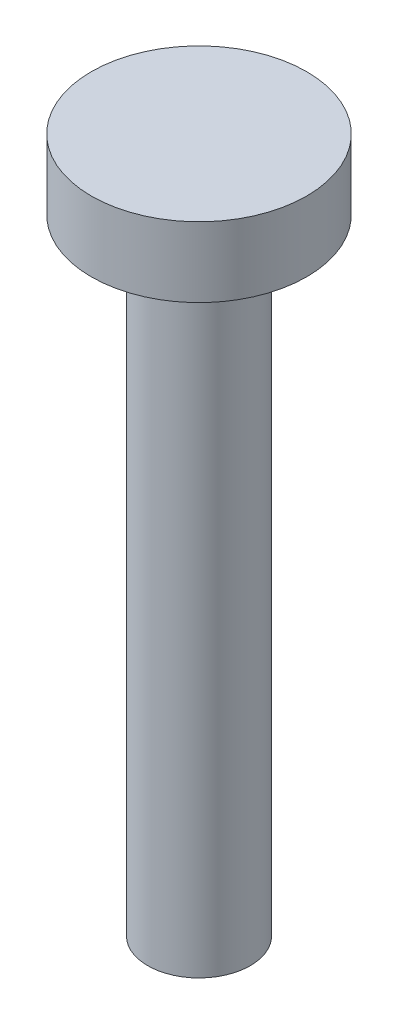
ISO-10303-21;
HEADER;
FILE_DESCRIPTION(('STEP AP214'),'2;1');
FILE_NAME('part.step','',(''),(''),'','','');
FILE_SCHEMA(('AUTOMOTIVE_DESIGN { 1 0 10303 214 1 1 1 1 }'));
ENDSEC;
DATA;
#1=APPLICATION_CONTEXT('core data for automotive mechanical design processes');
#2=APPLICATION_PROTOCOL_DEFINITION('international standard','automotive_design',2000,#1);
#3=PRODUCT_CONTEXT('',#1,'mechanical');
#4=PRODUCT('Part','Part','',(#3));
#5=PRODUCT_RELATED_PRODUCT_CATEGORY('part','',(#4));
#6=PRODUCT_DEFINITION_FORMATION('','',#4);
#7=PRODUCT_DEFINITION_CONTEXT('part definition',#1,'design');
#8=PRODUCT_DEFINITION('design','',#6,#7);
#9=PRODUCT_DEFINITION_SHAPE('','',#8);
#10=(LENGTH_UNIT() NAMED_UNIT(*) SI_UNIT(.MILLI.,.METRE.));
#11=(NAMED_UNIT(*) PLANE_ANGLE_UNIT() SI_UNIT($,.RADIAN.));
#12=(NAMED_UNIT(*) SI_UNIT($,.STERADIAN.) SOLID_ANGLE_UNIT());
#13=UNCERTAINTY_MEASURE_WITH_UNIT(LENGTH_MEASURE(1.E-05),#10,'distance_accuracy_value','');
#14=(GEOMETRIC_REPRESENTATION_CONTEXT(3) GLOBAL_UNCERTAINTY_ASSIGNED_CONTEXT((#13)) GLOBAL_UNIT_ASSIGNED_CONTEXT((#10,
#11,#12)) REPRESENTATION_CONTEXT('',''));
#15=CARTESIAN_POINT('',(0.,0.,0.));
#16=DIRECTION('',(0.,0.,1.));
#17=DIRECTION('',(1.,0.,0.));
#18=AXIS2_PLACEMENT_3D('',#15,#16,#17);
#19=CARTESIAN_POINT('',(0.,0.,0.));
#20=DIRECTION('',(0.,-1.,0.));
#21=DIRECTION('',(0.,0.,-1.));
#22=AXIS2_PLACEMENT_3D('',#19,#20,#21);
#23=PLANE('',#22);
#24=CARTESIAN_POINT('',(0.,0.,0.));
#25=DIRECTION('',(0.,-1.,0.));
#26=DIRECTION('',(0.,0.,-1.));
#27=AXIS2_PLACEMENT_3D('',#24,#25,#26);
#28=CIRCLE('',#27,4.7625);
#29=CARTESIAN_POINT('',(0.,0.,-4.7625));
#30=VERTEX_POINT('',#29);
#31=EDGE_CURVE('E10',#30,#30,#28,.T.);
#32=ORIENTED_EDGE('',*,*,#31,.T.);
#33=EDGE_LOOP('',(#32));
#34=FACE_BOUND('',#33,.T.);
#35=ADVANCED_FACE('F39',(#34),#23,.T.);
#36=CARTESIAN_POINT('',(0.,0.,0.));
#37=DIRECTION('',(0.,-1.,0.));
#38=DIRECTION('',(0.,0.,-1.));
#39=AXIS2_PLACEMENT_3D('',#36,#37,#38);
#40=CYLINDRICAL_SURFACE('',#39,4.7625);
#41=CARTESIAN_POINT('',(0.,58.,0.));
#42=DIRECTION('',(0.,-1.,0.));
#43=DIRECTION('',(0.,0.,-1.));
#44=AXIS2_PLACEMENT_3D('',#41,#42,#43);
#45=CIRCLE('',#44,4.7625);
#46=CARTESIAN_POINT('',(0.,58.,-4.7625));
#47=VERTEX_POINT('',#46);
#48=EDGE_CURVE('E44',#47,#47,#45,.T.);
#49=ORIENTED_EDGE('',*,*,#48,.T.);
#50=EDGE_LOOP('',(#49));
#51=FACE_BOUND('',#50,.T.);
#52=ORIENTED_EDGE('',*,*,#31,.F.);
#53=EDGE_LOOP('',(#52));
#54=FACE_BOUND('',#53,.T.);
#55=ADVANCED_FACE('F72',(#51,#54),#40,.T.);
#56=CARTESIAN_POINT('',(4.7625,58.,0.));
#57=DIRECTION('',(0.,-1.,0.));
#58=DIRECTION('',(0.,0.,-1.));
#59=AXIS2_PLACEMENT_3D('',#56,#57,#58);
#60=PLANE('',#59);
#61=CARTESIAN_POINT('',(0.,58.,0.));
#62=DIRECTION('',(0.,-1.,0.));
#63=DIRECTION('',(0.,0.,-1.));
#64=AXIS2_PLACEMENT_3D('',#61,#62,#63);
#65=CIRCLE('',#64,10.);
#66=CARTESIAN_POINT('',(0.,58.,-10.));
#67=VERTEX_POINT('',#66);
#68=EDGE_CURVE('E47',#67,#67,#65,.T.);
#69=ORIENTED_EDGE('',*,*,#68,.T.);
#70=EDGE_LOOP('',(#69));
#71=FACE_BOUND('',#70,.T.);
#72=ORIENTED_EDGE('',*,*,#48,.F.);
#73=EDGE_LOOP('',(#72));
#74=FACE_BOUND('',#73,.T.);
#75=ADVANCED_FACE('F66',(#71,#74),#60,.T.);
#76=CARTESIAN_POINT('',(0.,0.,0.));
#77=DIRECTION('',(0.,-1.,0.));
#78=DIRECTION('',(0.,0.,-1.));
#79=AXIS2_PLACEMENT_3D('',#76,#77,#78);
#80=CYLINDRICAL_SURFACE('',#79,10.);
#81=CARTESIAN_POINT('',(0.,64.5,0.));
#82=DIRECTION('',(0.,-1.,0.));
#83=DIRECTION('',(0.,0.,-1.));
#84=AXIS2_PLACEMENT_3D('',#81,#82,#83);
#85=CIRCLE('',#84,10.);
#86=CARTESIAN_POINT('',(0.,64.5,-10.));
#87=VERTEX_POINT('',#86);
#88=EDGE_CURVE('E52',#87,#87,#85,.T.);
#89=ORIENTED_EDGE('',*,*,#88,.T.);
#90=EDGE_LOOP('',(#89));
#91=FACE_BOUND('',#90,.T.);
#92=ORIENTED_EDGE('',*,*,#68,.F.);
#93=EDGE_LOOP('',(#92));
#94=FACE_BOUND('',#93,.T.);
#95=ADVANCED_FACE('F56',(#91,#94),#80,.T.);
#96=CARTESIAN_POINT('',(10.,64.5,0.));
#97=DIRECTION('',(0.,1.,0.));
#98=DIRECTION('',(0.,0.,1.));
#99=AXIS2_PLACEMENT_3D('',#96,#97,#98);
#100=PLANE('',#99);
#101=ORIENTED_EDGE('',*,*,#88,.F.);
#102=EDGE_LOOP('',(#101));
#103=FACE_BOUND('',#102,.T.);
#104=ADVANCED_FACE('F65',(#103),#100,.T.);
#105=CLOSED_SHELL('',(#35,#55,#75,#95,#104));
#106=MANIFOLD_SOLID_BREP('B2',#105);
#107=ADVANCED_BREP_SHAPE_REPRESENTATION('',(#18,#106),#14);
#108=SHAPE_DEFINITION_REPRESENTATION(#9,#107);
ENDSEC;
END-ISO-10303-21;
